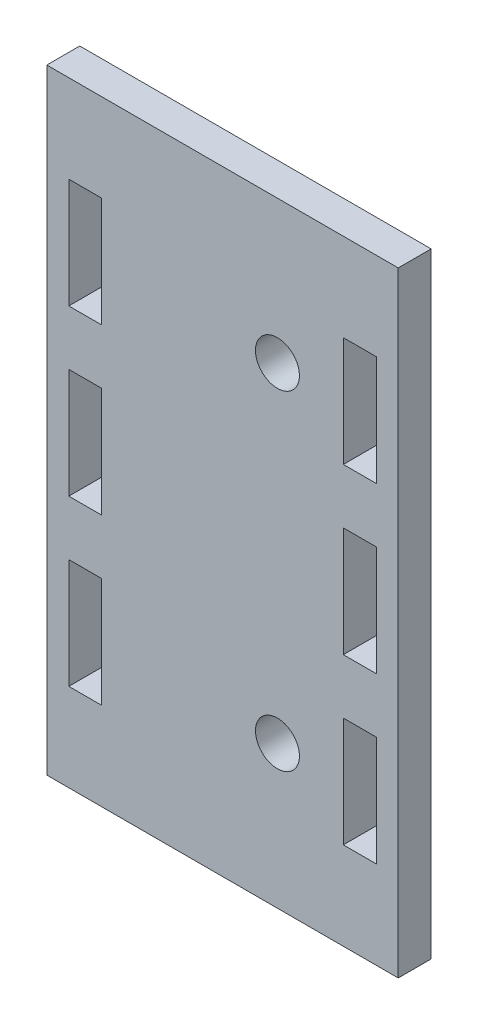
ISO-10303-21;
HEADER;
FILE_DESCRIPTION(('STEP AP214'),'2;1');
FILE_NAME('part.step','',(''),(''),'','','');
FILE_SCHEMA(('AUTOMOTIVE_DESIGN { 1 0 10303 214 1 1 1 1 }'));
ENDSEC;
DATA;
#1=APPLICATION_CONTEXT('core data for automotive mechanical design processes');
#2=APPLICATION_PROTOCOL_DEFINITION('international standard','automotive_design',2000,#1);
#3=PRODUCT_CONTEXT('',#1,'mechanical');
#4=PRODUCT('Part','Part','',(#3));
#5=PRODUCT_RELATED_PRODUCT_CATEGORY('part','',(#4));
#6=PRODUCT_DEFINITION_FORMATION('','',#4);
#7=PRODUCT_DEFINITION_CONTEXT('part definition',#1,'design');
#8=PRODUCT_DEFINITION('design','',#6,#7);
#9=PRODUCT_DEFINITION_SHAPE('','',#8);
#10=(LENGTH_UNIT() NAMED_UNIT(*) SI_UNIT(.MILLI.,.METRE.));
#11=(NAMED_UNIT(*) PLANE_ANGLE_UNIT() SI_UNIT($,.RADIAN.));
#12=(NAMED_UNIT(*) SI_UNIT($,.STERADIAN.) SOLID_ANGLE_UNIT());
#13=UNCERTAINTY_MEASURE_WITH_UNIT(LENGTH_MEASURE(1.E-05),#10,'distance_accuracy_value','');
#14=(GEOMETRIC_REPRESENTATION_CONTEXT(3) GLOBAL_UNCERTAINTY_ASSIGNED_CONTEXT((#13)) GLOBAL_UNIT_ASSIGNED_CONTEXT((#10,
#11,#12)) REPRESENTATION_CONTEXT('',''));
#15=CARTESIAN_POINT('',(0.,0.,0.));
#16=DIRECTION('',(0.,0.,1.));
#17=DIRECTION('',(1.,0.,0.));
#18=AXIS2_PLACEMENT_3D('',#15,#16,#17);
#19=CARTESIAN_POINT('',(0.,-20.,3.));
#20=DIRECTION('',(0.,-1.,0.));
#21=DIRECTION('',(0.,0.,-1.));
#22=AXIS2_PLACEMENT_3D('',#19,#20,#21);
#23=PLANE('',#22);
#24=DIRECTION('',(-1.,0.,0.));
#25=VECTOR('',#24,1.);
#26=CARTESIAN_POINT('',(0.,-20.,0.));
#27=LINE('',#26,#25);
#28=CARTESIAN_POINT('',(-1.99999999999999,-20.,0.));
#29=VERTEX_POINT('',#28);
#30=CARTESIAN_POINT('',(-4.99999999999999,-20.,0.));
#31=VERTEX_POINT('',#30);
#32=EDGE_CURVE('E331',#29,#31,#27,.T.);
#33=ORIENTED_EDGE('',*,*,#32,.T.);
#34=DIRECTION('',(0.,0.,-1.));
#35=VECTOR('',#34,1.);
#36=CARTESIAN_POINT('',(-4.99999999999999,-20.,3.));
#37=LINE('',#36,#35);
#38=CARTESIAN_POINT('',(-4.99999999999999,-20.,3.));
#39=VERTEX_POINT('',#38);
#40=EDGE_CURVE('E11',#39,#31,#37,.T.);
#41=ORIENTED_EDGE('',*,*,#40,.F.);
#42=DIRECTION('',(-1.,0.,0.));
#43=VECTOR('',#42,1.);
#44=CARTESIAN_POINT('',(0.,-20.,3.));
#45=LINE('',#44,#43);
#46=CARTESIAN_POINT('',(-1.99999999999999,-20.,3.));
#47=VERTEX_POINT('',#46);
#48=EDGE_CURVE('E239',#47,#39,#45,.T.);
#49=ORIENTED_EDGE('',*,*,#48,.F.);
#50=DIRECTION('',(0.,0.,-1.));
#51=VECTOR('',#50,1.);
#52=CARTESIAN_POINT('',(-1.99999999999999,-20.,3.));
#53=LINE('',#52,#51);
#54=EDGE_CURVE('E57',#47,#29,#53,.T.);
#55=ORIENTED_EDGE('',*,*,#54,.T.);
#56=EDGE_LOOP('',(#33,#41,#49,#55));
#57=FACE_BOUND('',#56,.T.);
#58=ADVANCED_FACE('F38',(#57),#23,.F.);
#59=CARTESIAN_POINT('',(-4.99999999999999,0.,3.));
#60=DIRECTION('',(-1.,0.,0.));
#61=DIRECTION('',(0.,0.,1.));
#62=AXIS2_PLACEMENT_3D('',#59,#60,#61);
#63=PLANE('',#62);
#64=DIRECTION('',(0.,1.,0.));
#65=VECTOR('',#64,1.);
#66=CARTESIAN_POINT('',(-4.99999999999999,0.,0.));
#67=LINE('',#66,#65);
#68=CARTESIAN_POINT('',(-4.99999999999999,-10.,0.));
#69=VERTEX_POINT('',#68);
#70=EDGE_CURVE('E245',#31,#69,#67,.T.);
#71=ORIENTED_EDGE('',*,*,#70,.T.);
#72=DIRECTION('',(0.,0.,-1.));
#73=VECTOR('',#72,1.);
#74=CARTESIAN_POINT('',(-4.99999999999999,-10.,3.));
#75=LINE('',#74,#73);
#76=CARTESIAN_POINT('',(-4.99999999999999,-10.,3.));
#77=VERTEX_POINT('',#76);
#78=EDGE_CURVE('E48',#77,#69,#75,.T.);
#79=ORIENTED_EDGE('',*,*,#78,.F.);
#80=DIRECTION('',(0.,1.,0.));
#81=VECTOR('',#80,1.);
#82=CARTESIAN_POINT('',(-4.99999999999999,0.,3.));
#83=LINE('',#82,#81);
#84=EDGE_CURVE('E232',#39,#77,#83,.T.);
#85=ORIENTED_EDGE('',*,*,#84,.F.);
#86=ORIENTED_EDGE('',*,*,#40,.T.);
#87=EDGE_LOOP('',(#71,#79,#85,#86));
#88=FACE_BOUND('',#87,.T.);
#89=ADVANCED_FACE('F244',(#88),#63,.F.);
#90=CARTESIAN_POINT('',(0.,-10.,3.));
#91=DIRECTION('',(0.,-1.,0.));
#92=DIRECTION('',(1.,0.,0.));
#93=AXIS2_PLACEMENT_3D('',#90,#91,#92);
#94=PLANE('',#93);
#95=DIRECTION('',(-1.,0.,0.));
#96=VECTOR('',#95,1.);
#97=CARTESIAN_POINT('',(0.,-10.,0.));
#98=LINE('',#97,#96);
#99=CARTESIAN_POINT('',(-1.99999999999999,-10.,0.));
#100=VERTEX_POINT('',#99);
#101=EDGE_CURVE('E334',#100,#69,#98,.T.);
#102=ORIENTED_EDGE('',*,*,#101,.F.);
#103=DIRECTION('',(0.,0.,-1.));
#104=VECTOR('',#103,1.);
#105=CARTESIAN_POINT('',(-1.99999999999999,-10.,3.));
#106=LINE('',#105,#104);
#107=CARTESIAN_POINT('',(-1.99999999999999,-10.,3.));
#108=VERTEX_POINT('',#107);
#109=EDGE_CURVE('E143',#108,#100,#106,.T.);
#110=ORIENTED_EDGE('',*,*,#109,.F.);
#111=DIRECTION('',(-1.,0.,0.));
#112=VECTOR('',#111,1.);
#113=CARTESIAN_POINT('',(0.,-10.,3.));
#114=LINE('',#113,#112);
#115=EDGE_CURVE('E238',#108,#77,#114,.T.);
#116=ORIENTED_EDGE('',*,*,#115,.T.);
#117=ORIENTED_EDGE('',*,*,#78,.T.);
#118=EDGE_LOOP('',(#102,#110,#116,#117));
#119=FACE_BOUND('',#118,.T.);
#120=ADVANCED_FACE('F249',(#119),#94,.T.);
#121=CARTESIAN_POINT('',(0.,20.,3.));
#122=DIRECTION('',(0.,1.,0.));
#123=DIRECTION('',(0.,0.,1.));
#124=AXIS2_PLACEMENT_3D('',#121,#122,#123);
#125=PLANE('',#124);
#126=DIRECTION('',(1.,0.,0.));
#127=VECTOR('',#126,1.);
#128=CARTESIAN_POINT('',(0.,20.,0.));
#129=LINE('',#128,#127);
#130=CARTESIAN_POINT('',(20.,20.,0.));
#131=VERTEX_POINT('',#130);
#132=CARTESIAN_POINT('',(23.,20.,0.));
#133=VERTEX_POINT('',#132);
#134=EDGE_CURVE('E319',#131,#133,#129,.T.);
#135=ORIENTED_EDGE('',*,*,#134,.T.);
#136=DIRECTION('',(0.,0.,-1.));
#137=VECTOR('',#136,1.);
#138=CARTESIAN_POINT('',(23.,20.,3.));
#139=LINE('',#138,#137);
#140=CARTESIAN_POINT('',(23.,20.,3.));
#141=VERTEX_POINT('',#140);
#142=EDGE_CURVE('E347',#141,#133,#139,.T.);
#143=ORIENTED_EDGE('',*,*,#142,.F.);
#144=DIRECTION('',(1.,0.,0.));
#145=VECTOR('',#144,1.);
#146=CARTESIAN_POINT('',(0.,20.,3.));
#147=LINE('',#146,#145);
#148=CARTESIAN_POINT('',(20.,20.,3.));
#149=VERTEX_POINT('',#148);
#150=EDGE_CURVE('E468',#149,#141,#147,.T.);
#151=ORIENTED_EDGE('',*,*,#150,.F.);
#152=DIRECTION('',(0.,0.,-1.));
#153=VECTOR('',#152,1.);
#154=CARTESIAN_POINT('',(20.,20.,3.));
#155=LINE('',#154,#153);
#156=EDGE_CURVE('E349',#149,#131,#155,.T.);
#157=ORIENTED_EDGE('',*,*,#156,.T.);
#158=EDGE_LOOP('',(#135,#143,#151,#157));
#159=FACE_BOUND('',#158,.T.);
#160=ADVANCED_FACE('F494',(#159),#125,.F.);
#161=CARTESIAN_POINT('',(23.,0.,3.));
#162=DIRECTION('',(1.,0.,0.));
#163=DIRECTION('',(0.,1.,0.));
#164=AXIS2_PLACEMENT_3D('',#161,#162,#163);
#165=PLANE('',#164);
#166=DIRECTION('',(0.,-1.,0.));
#167=VECTOR('',#166,1.);
#168=CARTESIAN_POINT('',(23.,0.,0.));
#169=LINE('',#168,#167);
#170=CARTESIAN_POINT('',(23.,10.,0.));
#171=VERTEX_POINT('',#170);
#172=EDGE_CURVE('E322',#133,#171,#169,.T.);
#173=ORIENTED_EDGE('',*,*,#172,.T.);
#174=DIRECTION('',(0.,0.,-1.));
#175=VECTOR('',#174,1.);
#176=CARTESIAN_POINT('',(23.,10.,3.));
#177=LINE('',#176,#175);
#178=CARTESIAN_POINT('',(23.,10.,3.));
#179=VERTEX_POINT('',#178);
#180=EDGE_CURVE('E354',#179,#171,#177,.T.);
#181=ORIENTED_EDGE('',*,*,#180,.F.);
#182=DIRECTION('',(0.,-1.,0.));
#183=VECTOR('',#182,1.);
#184=CARTESIAN_POINT('',(23.,0.,3.));
#185=LINE('',#184,#183);
#186=EDGE_CURVE('E471',#141,#179,#185,.T.);
#187=ORIENTED_EDGE('',*,*,#186,.F.);
#188=ORIENTED_EDGE('',*,*,#142,.T.);
#189=EDGE_LOOP('',(#173,#181,#187,#188));
#190=FACE_BOUND('',#189,.T.);
#191=ADVANCED_FACE('F496',(#190),#165,.F.);
#192=CARTESIAN_POINT('',(0.,10.,3.));
#193=DIRECTION('',(0.,1.,0.));
#194=DIRECTION('',(0.,0.,1.));
#195=AXIS2_PLACEMENT_3D('',#192,#193,#194);
#196=PLANE('',#195);
#197=DIRECTION('',(1.,0.,0.));
#198=VECTOR('',#197,1.);
#199=CARTESIAN_POINT('',(0.,10.,0.));
#200=LINE('',#199,#198);
#201=CARTESIAN_POINT('',(20.,10.,0.));
#202=VERTEX_POINT('',#201);
#203=EDGE_CURVE('E325',#202,#171,#200,.T.);
#204=ORIENTED_EDGE('',*,*,#203,.F.);
#205=DIRECTION('',(0.,0.,-1.));
#206=VECTOR('',#205,1.);
#207=CARTESIAN_POINT('',(20.,10.,3.));
#208=LINE('',#207,#206);
#209=CARTESIAN_POINT('',(20.,10.,3.));
#210=VERTEX_POINT('',#209);
#211=EDGE_CURVE('E351',#210,#202,#208,.T.);
#212=ORIENTED_EDGE('',*,*,#211,.F.);
#213=DIRECTION('',(1.,0.,0.));
#214=VECTOR('',#213,1.);
#215=CARTESIAN_POINT('',(0.,10.,3.));
#216=LINE('',#215,#214);
#217=EDGE_CURVE('E473',#210,#179,#216,.T.);
#218=ORIENTED_EDGE('',*,*,#217,.T.);
#219=ORIENTED_EDGE('',*,*,#180,.T.);
#220=EDGE_LOOP('',(#204,#212,#218,#219));
#221=FACE_BOUND('',#220,.T.);
#222=ADVANCED_FACE('F489',(#221),#196,.T.);
#223=CARTESIAN_POINT('',(0.,-5.00000000000001,3.));
#224=DIRECTION('',(0.,1.,0.));
#225=DIRECTION('',(-1.,0.,0.));
#226=AXIS2_PLACEMENT_3D('',#223,#224,#225);
#227=PLANE('',#226);
#228=DIRECTION('',(1.,0.,0.));
#229=VECTOR('',#228,1.);
#230=CARTESIAN_POINT('',(0.,-5.00000000000001,0.));
#231=LINE('',#230,#229);
#232=CARTESIAN_POINT('',(20.0000000000002,-5.,0.));
#233=VERTEX_POINT('',#232);
#234=CARTESIAN_POINT('',(22.9999999999997,-5.,0.));
#235=VERTEX_POINT('',#234);
#236=EDGE_CURVE('E307',#233,#235,#231,.T.);
#237=ORIENTED_EDGE('',*,*,#236,.F.);
#238=DIRECTION('',(0.,0.,-1.));
#239=VECTOR('',#238,1.);
#240=CARTESIAN_POINT('',(20.0000000000002,-5.,3.));
#241=LINE('',#240,#239);
#242=CARTESIAN_POINT('',(20.0000000000002,-5.,3.));
#243=VERTEX_POINT('',#242);
#244=EDGE_CURVE('E352',#243,#233,#241,.T.);
#245=ORIENTED_EDGE('',*,*,#244,.F.);
#246=DIRECTION('',(1.,0.,0.));
#247=VECTOR('',#246,1.);
#248=CARTESIAN_POINT('',(0.,-5.00000000000001,3.));
#249=LINE('',#248,#247);
#250=CARTESIAN_POINT('',(22.9999999999997,-5.,3.));
#251=VERTEX_POINT('',#250);
#252=EDGE_CURVE('E457',#243,#251,#249,.T.);
#253=ORIENTED_EDGE('',*,*,#252,.T.);
#254=DIRECTION('',(0.,0.,-1.));
#255=VECTOR('',#254,1.);
#256=CARTESIAN_POINT('',(22.9999999999997,-5.,3.));
#257=LINE('',#256,#255);
#258=EDGE_CURVE('E358',#251,#235,#257,.T.);
#259=ORIENTED_EDGE('',*,*,#258,.T.);
#260=EDGE_LOOP('',(#237,#245,#253,#259));
#261=FACE_BOUND('',#260,.T.);
#262=ADVANCED_FACE('F503',(#261),#227,.T.);
#263=CARTESIAN_POINT('',(20.0000000000002,0.,3.));
#264=DIRECTION('',(1.,0.,0.));
#265=DIRECTION('',(0.,0.,-1.));
#266=AXIS2_PLACEMENT_3D('',#263,#264,#265);
#267=PLANE('',#266);
#268=DIRECTION('',(0.,-1.,0.));
#269=VECTOR('',#268,1.);
#270=CARTESIAN_POINT('',(20.0000000000002,0.,0.));
#271=LINE('',#270,#269);
#272=CARTESIAN_POINT('',(20.0000000000002,5.,0.));
#273=VERTEX_POINT('',#272);
#274=EDGE_CURVE('E310',#273,#233,#271,.T.);
#275=ORIENTED_EDGE('',*,*,#274,.F.);
#276=DIRECTION('',(0.,0.,-1.));
#277=VECTOR('',#276,1.);
#278=CARTESIAN_POINT('',(20.0000000000002,5.,3.));
#279=LINE('',#278,#277);
#280=CARTESIAN_POINT('',(20.0000000000002,5.,3.));
#281=VERTEX_POINT('',#280);
#282=EDGE_CURVE('E364',#281,#273,#279,.T.);
#283=ORIENTED_EDGE('',*,*,#282,.F.);
#284=DIRECTION('',(0.,-1.,0.));
#285=VECTOR('',#284,1.);
#286=CARTESIAN_POINT('',(20.0000000000002,0.,3.));
#287=LINE('',#286,#285);
#288=EDGE_CURVE('E460',#281,#243,#287,.T.);
#289=ORIENTED_EDGE('',*,*,#288,.T.);
#290=ORIENTED_EDGE('',*,*,#244,.T.);
#291=EDGE_LOOP('',(#275,#283,#289,#290));
#292=FACE_BOUND('',#291,.T.);
#293=ADVANCED_FACE('F560',(#292),#267,.T.);
#294=CARTESIAN_POINT('',(0.,4.99999999999999,3.));
#295=DIRECTION('',(0.,1.,0.));
#296=DIRECTION('',(-1.,0.,0.));
#297=AXIS2_PLACEMENT_3D('',#294,#295,#296);
#298=PLANE('',#297);
#299=DIRECTION('',(1.,0.,0.));
#300=VECTOR('',#299,1.);
#301=CARTESIAN_POINT('',(0.,4.99999999999999,0.));
#302=LINE('',#301,#300);
#303=CARTESIAN_POINT('',(22.9999999999997,5.,0.));
#304=VERTEX_POINT('',#303);
#305=EDGE_CURVE('E313',#273,#304,#302,.T.);
#306=ORIENTED_EDGE('',*,*,#305,.T.);
#307=DIRECTION('',(0.,0.,-1.));
#308=VECTOR('',#307,1.);
#309=CARTESIAN_POINT('',(22.9999999999997,5.,3.));
#310=LINE('',#309,#308);
#311=CARTESIAN_POINT('',(22.9999999999997,5.,3.));
#312=VERTEX_POINT('',#311);
#313=EDGE_CURVE('E360',#312,#304,#310,.T.);
#314=ORIENTED_EDGE('',*,*,#313,.F.);
#315=DIRECTION('',(1.,0.,0.));
#316=VECTOR('',#315,1.);
#317=CARTESIAN_POINT('',(0.,4.99999999999999,3.));
#318=LINE('',#317,#316);
#319=EDGE_CURVE('E463',#281,#312,#318,.T.);
#320=ORIENTED_EDGE('',*,*,#319,.F.);
#321=ORIENTED_EDGE('',*,*,#282,.T.);
#322=EDGE_LOOP('',(#306,#314,#320,#321));
#323=FACE_BOUND('',#322,.T.);
#324=ADVANCED_FACE('F571',(#323),#298,.F.);
#325=CARTESIAN_POINT('',(0.,-20.,3.));
#326=DIRECTION('',(0.,1.,0.));
#327=DIRECTION('',(0.,0.,1.));
#328=AXIS2_PLACEMENT_3D('',#325,#326,#327);
#329=PLANE('',#328);
#330=DIRECTION('',(1.,0.,0.));
#331=VECTOR('',#330,1.);
#332=CARTESIAN_POINT('',(0.,-20.,0.));
#333=LINE('',#332,#331);
#334=CARTESIAN_POINT('',(20.0000000000003,-20.,0.));
#335=VERTEX_POINT('',#334);
#336=CARTESIAN_POINT('',(22.9999999999978,-20.,0.));
#337=VERTEX_POINT('',#336);
#338=EDGE_CURVE('E295',#335,#337,#333,.T.);
#339=ORIENTED_EDGE('',*,*,#338,.F.);
#340=DIRECTION('',(0.,0.,-1.));
#341=VECTOR('',#340,1.);
#342=CARTESIAN_POINT('',(20.0000000000003,-20.,3.));
#343=LINE('',#342,#341);
#344=CARTESIAN_POINT('',(20.0000000000003,-20.,3.));
#345=VERTEX_POINT('',#344);
#346=EDGE_CURVE('E361',#345,#335,#343,.T.);
#347=ORIENTED_EDGE('',*,*,#346,.F.);
#348=DIRECTION('',(1.,0.,0.));
#349=VECTOR('',#348,1.);
#350=CARTESIAN_POINT('',(0.,-20.,3.));
#351=LINE('',#350,#349);
#352=CARTESIAN_POINT('',(22.9999999999978,-20.,3.));
#353=VERTEX_POINT('',#352);
#354=EDGE_CURVE('E446',#345,#353,#351,.T.);
#355=ORIENTED_EDGE('',*,*,#354,.T.);
#356=DIRECTION('',(0.,0.,-1.));
#357=VECTOR('',#356,1.);
#358=CARTESIAN_POINT('',(22.9999999999978,-20.,3.));
#359=LINE('',#358,#357);
#360=EDGE_CURVE('E367',#353,#337,#359,.T.);
#361=ORIENTED_EDGE('',*,*,#360,.T.);
#362=EDGE_LOOP('',(#339,#347,#355,#361));
#363=FACE_BOUND('',#362,.T.);
#364=ADVANCED_FACE('F581',(#363),#329,.T.);
#365=CARTESIAN_POINT('',(20.0000000000003,0.,3.));
#366=DIRECTION('',(1.,0.,0.));
#367=DIRECTION('',(0.,0.,-1.));
#368=AXIS2_PLACEMENT_3D('',#365,#366,#367);
#369=PLANE('',#368);
#370=DIRECTION('',(0.,-1.,0.));
#371=VECTOR('',#370,1.);
#372=CARTESIAN_POINT('',(20.0000000000003,0.,0.));
#373=LINE('',#372,#371);
#374=CARTESIAN_POINT('',(20.0000000000003,-10.,0.));
#375=VERTEX_POINT('',#374);
#376=EDGE_CURVE('E298',#375,#335,#373,.T.);
#377=ORIENTED_EDGE('',*,*,#376,.F.);
#378=DIRECTION('',(0.,0.,-1.));
#379=VECTOR('',#378,1.);
#380=CARTESIAN_POINT('',(20.0000000000003,-10.,3.));
#381=LINE('',#380,#379);
#382=CARTESIAN_POINT('',(20.0000000000003,-10.,3.));
#383=VERTEX_POINT('',#382);
#384=EDGE_CURVE('E373',#383,#375,#381,.T.);
#385=ORIENTED_EDGE('',*,*,#384,.F.);
#386=DIRECTION('',(0.,-1.,0.));
#387=VECTOR('',#386,1.);
#388=CARTESIAN_POINT('',(20.0000000000003,0.,3.));
#389=LINE('',#388,#387);
#390=EDGE_CURVE('E449',#383,#345,#389,.T.);
#391=ORIENTED_EDGE('',*,*,#390,.T.);
#392=ORIENTED_EDGE('',*,*,#346,.T.);
#393=EDGE_LOOP('',(#377,#385,#391,#392));
#394=FACE_BOUND('',#393,.T.);
#395=ADVANCED_FACE('F591',(#394),#369,.T.);
#396=CARTESIAN_POINT('',(0.,-10.,3.));
#397=DIRECTION('',(0.,1.,0.));
#398=DIRECTION('',(0.,0.,1.));
#399=AXIS2_PLACEMENT_3D('',#396,#397,#398);
#400=PLANE('',#399);
#401=DIRECTION('',(1.,0.,0.));
#402=VECTOR('',#401,1.);
#403=CARTESIAN_POINT('',(0.,-10.,0.));
#404=LINE('',#403,#402);
#405=CARTESIAN_POINT('',(22.9999999999978,-10.,0.));
#406=VERTEX_POINT('',#405);
#407=EDGE_CURVE('E301',#375,#406,#404,.T.);
#408=ORIENTED_EDGE('',*,*,#407,.T.);
#409=DIRECTION('',(0.,0.,-1.));
#410=VECTOR('',#409,1.);
#411=CARTESIAN_POINT('',(22.9999999999978,-10.,3.));
#412=LINE('',#411,#410);
#413=CARTESIAN_POINT('',(22.9999999999978,-10.,3.));
#414=VERTEX_POINT('',#413);
#415=EDGE_CURVE('E369',#414,#406,#412,.T.);
#416=ORIENTED_EDGE('',*,*,#415,.F.);
#417=DIRECTION('',(1.,0.,0.));
#418=VECTOR('',#417,1.);
#419=CARTESIAN_POINT('',(0.,-10.,3.));
#420=LINE('',#419,#418);
#421=EDGE_CURVE('E452',#383,#414,#420,.T.);
#422=ORIENTED_EDGE('',*,*,#421,.F.);
#423=ORIENTED_EDGE('',*,*,#384,.T.);
#424=EDGE_LOOP('',(#408,#416,#422,#423));
#425=FACE_BOUND('',#424,.T.);
#426=ADVANCED_FACE('F602',(#425),#400,.F.);
#427=CARTESIAN_POINT('',(0.,5.,3.));
#428=DIRECTION('',(0.,-1.,0.));
#429=DIRECTION('',(1.,0.,0.));
#430=AXIS2_PLACEMENT_3D('',#427,#428,#429);
#431=PLANE('',#430);
#432=DIRECTION('',(-1.,0.,0.));
#433=VECTOR('',#432,1.);
#434=CARTESIAN_POINT('',(0.,5.,0.));
#435=LINE('',#434,#433);
#436=CARTESIAN_POINT('',(-2.00000000000004,5.,0.));
#437=VERTEX_POINT('',#436);
#438=CARTESIAN_POINT('',(-5.00000000000004,5.,0.));
#439=VERTEX_POINT('',#438);
#440=EDGE_CURVE('E283',#437,#439,#435,.T.);
#441=ORIENTED_EDGE('',*,*,#440,.F.);
#442=DIRECTION('',(0.,0.,-1.));
#443=VECTOR('',#442,1.);
#444=CARTESIAN_POINT('',(-2.00000000000004,5.,3.));
#445=LINE('',#444,#443);
#446=CARTESIAN_POINT('',(-2.00000000000004,5.,3.));
#447=VERTEX_POINT('',#446);
#448=EDGE_CURVE('E370',#447,#437,#445,.T.);
#449=ORIENTED_EDGE('',*,*,#448,.F.);
#450=DIRECTION('',(-1.,0.,0.));
#451=VECTOR('',#450,1.);
#452=CARTESIAN_POINT('',(0.,5.,3.));
#453=LINE('',#452,#451);
#454=CARTESIAN_POINT('',(-5.00000000000004,5.,3.));
#455=VERTEX_POINT('',#454);
#456=EDGE_CURVE('E435',#447,#455,#453,.T.);
#457=ORIENTED_EDGE('',*,*,#456,.T.);
#458=DIRECTION('',(0.,0.,-1.));
#459=VECTOR('',#458,1.);
#460=CARTESIAN_POINT('',(-5.00000000000004,5.,3.));
#461=LINE('',#460,#459);
#462=EDGE_CURVE('E376',#455,#439,#461,.T.);
#463=ORIENTED_EDGE('',*,*,#462,.T.);
#464=EDGE_LOOP('',(#441,#449,#457,#463));
#465=FACE_BOUND('',#464,.T.);
#466=ADVANCED_FACE('F612',(#465),#431,.T.);
#467=CARTESIAN_POINT('',(-2.00000000000004,0.,3.));
#468=DIRECTION('',(-1.,0.,0.));
#469=DIRECTION('',(0.,-1.,0.));
#470=AXIS2_PLACEMENT_3D('',#467,#468,#469);
#471=PLANE('',#470);
#472=DIRECTION('',(0.,1.,0.));
#473=VECTOR('',#472,1.);
#474=CARTESIAN_POINT('',(-2.00000000000004,0.,0.));
#475=LINE('',#474,#473);
#476=CARTESIAN_POINT('',(-2.00000000000004,-5.,0.));
#477=VERTEX_POINT('',#476);
#478=EDGE_CURVE('E286',#477,#437,#475,.T.);
#479=ORIENTED_EDGE('',*,*,#478,.F.);
#480=DIRECTION('',(0.,0.,-1.));
#481=VECTOR('',#480,1.);
#482=CARTESIAN_POINT('',(-2.00000000000004,-5.,3.));
#483=LINE('',#482,#481);
#484=CARTESIAN_POINT('',(-2.00000000000004,-5.,3.));
#485=VERTEX_POINT('',#484);
#486=EDGE_CURVE('E382',#485,#477,#483,.T.);
#487=ORIENTED_EDGE('',*,*,#486,.F.);
#488=DIRECTION('',(0.,1.,0.));
#489=VECTOR('',#488,1.);
#490=CARTESIAN_POINT('',(-2.00000000000004,0.,3.));
#491=LINE('',#490,#489);
#492=EDGE_CURVE('E438',#485,#447,#491,.T.);
#493=ORIENTED_EDGE('',*,*,#492,.T.);
#494=ORIENTED_EDGE('',*,*,#448,.T.);
#495=EDGE_LOOP('',(#479,#487,#493,#494));
#496=FACE_BOUND('',#495,.T.);
#497=ADVANCED_FACE('F622',(#496),#471,.T.);
#498=CARTESIAN_POINT('',(0.,-5.,3.));
#499=DIRECTION('',(0.,-1.,0.));
#500=DIRECTION('',(0.,0.,-1.));
#501=AXIS2_PLACEMENT_3D('',#498,#499,#500);
#502=PLANE('',#501);
#503=DIRECTION('',(-1.,0.,0.));
#504=VECTOR('',#503,1.);
#505=CARTESIAN_POINT('',(0.,-5.,0.));
#506=LINE('',#505,#504);
#507=CARTESIAN_POINT('',(-5.00000000000004,-5.,0.));
#508=VERTEX_POINT('',#507);
#509=EDGE_CURVE('E289',#477,#508,#506,.T.);
#510=ORIENTED_EDGE('',*,*,#509,.T.);
#511=DIRECTION('',(0.,0.,-1.));
#512=VECTOR('',#511,1.);
#513=CARTESIAN_POINT('',(-5.00000000000004,-5.,3.));
#514=LINE('',#513,#512);
#515=CARTESIAN_POINT('',(-5.00000000000004,-5.,3.));
#516=VERTEX_POINT('',#515);
#517=EDGE_CURVE('E378',#516,#508,#514,.T.);
#518=ORIENTED_EDGE('',*,*,#517,.F.);
#519=DIRECTION('',(-1.,0.,0.));
#520=VECTOR('',#519,1.);
#521=CARTESIAN_POINT('',(0.,-5.,3.));
#522=LINE('',#521,#520);
#523=EDGE_CURVE('E441',#485,#516,#522,.T.);
#524=ORIENTED_EDGE('',*,*,#523,.F.);
#525=ORIENTED_EDGE('',*,*,#486,.T.);
#526=EDGE_LOOP('',(#510,#518,#524,#525));
#527=FACE_BOUND('',#526,.T.);
#528=ADVANCED_FACE('F632',(#527),#502,.F.);
#529=CARTESIAN_POINT('',(0.,20.,3.));
#530=DIRECTION('',(0.,-1.,0.));
#531=DIRECTION('',(0.,0.,-1.));
#532=AXIS2_PLACEMENT_3D('',#529,#530,#531);
#533=PLANE('',#532);
#534=DIRECTION('',(-1.,0.,0.));
#535=VECTOR('',#534,1.);
#536=CARTESIAN_POINT('',(0.,20.,0.));
#537=LINE('',#536,#535);
#538=CARTESIAN_POINT('',(-2.0000000000001,20.,0.));
#539=VERTEX_POINT('',#538);
#540=CARTESIAN_POINT('',(-5.0000000000001,20.,0.));
#541=VERTEX_POINT('',#540);
#542=EDGE_CURVE('E271',#539,#541,#537,.T.);
#543=ORIENTED_EDGE('',*,*,#542,.F.);
#544=DIRECTION('',(0.,0.,-1.));
#545=VECTOR('',#544,1.);
#546=CARTESIAN_POINT('',(-2.0000000000001,20.,3.));
#547=LINE('',#546,#545);
#548=CARTESIAN_POINT('',(-2.0000000000001,20.,3.));
#549=VERTEX_POINT('',#548);
#550=EDGE_CURVE('E379',#549,#539,#547,.T.);
#551=ORIENTED_EDGE('',*,*,#550,.F.);
#552=DIRECTION('',(-1.,0.,0.));
#553=VECTOR('',#552,1.);
#554=CARTESIAN_POINT('',(0.,20.,3.));
#555=LINE('',#554,#553);
#556=CARTESIAN_POINT('',(-5.0000000000001,20.,3.));
#557=VERTEX_POINT('',#556);
#558=EDGE_CURVE('E419',#549,#557,#555,.T.);
#559=ORIENTED_EDGE('',*,*,#558,.T.);
#560=DIRECTION('',(0.,0.,-1.));
#561=VECTOR('',#560,1.);
#562=CARTESIAN_POINT('',(-5.0000000000001,20.,3.));
#563=LINE('',#562,#561);
#564=EDGE_CURVE('E385',#557,#541,#563,.T.);
#565=ORIENTED_EDGE('',*,*,#564,.T.);
#566=EDGE_LOOP('',(#543,#551,#559,#565));
#567=FACE_BOUND('',#566,.T.);
#568=ADVANCED_FACE('F642',(#567),#533,.T.);
#569=CARTESIAN_POINT('',(-2.00000000000009,0.,3.));
#570=DIRECTION('',(-1.,0.,0.));
#571=DIRECTION('',(0.,-1.,0.));
#572=AXIS2_PLACEMENT_3D('',#569,#570,#571);
#573=PLANE('',#572);
#574=DIRECTION('',(0.,1.,0.));
#575=VECTOR('',#574,1.);
#576=CARTESIAN_POINT('',(-2.00000000000009,0.,0.));
#577=LINE('',#576,#575);
#578=CARTESIAN_POINT('',(-2.00000000000009,9.99999999999999,0.));
#579=VERTEX_POINT('',#578);
#580=EDGE_CURVE('E274',#579,#539,#577,.T.);
#581=ORIENTED_EDGE('',*,*,#580,.F.);
#582=DIRECTION('',(0.,0.,-1.));
#583=VECTOR('',#582,1.);
#584=CARTESIAN_POINT('',(-2.00000000000009,9.99999999999999,3.));
#585=LINE('',#584,#583);
#586=CARTESIAN_POINT('',(-2.00000000000009,9.99999999999999,3.));
#587=VERTEX_POINT('',#586);
#588=EDGE_CURVE('E390',#587,#579,#585,.T.);
#589=ORIENTED_EDGE('',*,*,#588,.F.);
#590=DIRECTION('',(0.,1.,0.));
#591=VECTOR('',#590,1.);
#592=CARTESIAN_POINT('',(-2.00000000000009,0.,3.));
#593=LINE('',#592,#591);
#594=EDGE_CURVE('E423',#587,#549,#593,.T.);
#595=ORIENTED_EDGE('',*,*,#594,.T.);
#596=ORIENTED_EDGE('',*,*,#550,.T.);
#597=EDGE_LOOP('',(#581,#589,#595,#596));
#598=FACE_BOUND('',#597,.T.);
#599=ADVANCED_FACE('F652',(#598),#573,.T.);
#600=CARTESIAN_POINT('',(0.,9.99999999999999,3.));
#601=DIRECTION('',(0.,-1.,0.));
#602=DIRECTION('',(0.,0.,-1.));
#603=AXIS2_PLACEMENT_3D('',#600,#601,#602);
#604=PLANE('',#603);
#605=DIRECTION('',(-1.,0.,0.));
#606=VECTOR('',#605,1.);
#607=CARTESIAN_POINT('',(0.,9.99999999999999,0.));
#608=LINE('',#607,#606);
#609=CARTESIAN_POINT('',(-5.0000000000001,9.99999999999999,0.));
#610=VERTEX_POINT('',#609);
#611=EDGE_CURVE('E277',#579,#610,#608,.T.);
#612=ORIENTED_EDGE('',*,*,#611,.T.);
#613=DIRECTION('',(0.,0.,-1.));
#614=VECTOR('',#613,1.);
#615=CARTESIAN_POINT('',(-5.0000000000001,9.99999999999999,3.));
#616=LINE('',#615,#614);
#617=CARTESIAN_POINT('',(-5.0000000000001,9.99999999999999,3.));
#618=VERTEX_POINT('',#617);
#619=EDGE_CURVE('E387',#618,#610,#616,.T.);
#620=ORIENTED_EDGE('',*,*,#619,.F.);
#621=DIRECTION('',(-1.,0.,0.));
#622=VECTOR('',#621,1.);
#623=CARTESIAN_POINT('',(0.,9.99999999999999,3.));
#624=LINE('',#623,#622);
#625=EDGE_CURVE('E430',#587,#618,#624,.T.);
#626=ORIENTED_EDGE('',*,*,#625,.F.);
#627=ORIENTED_EDGE('',*,*,#588,.T.);
#628=EDGE_LOOP('',(#612,#620,#626,#627));
#629=FACE_BOUND('',#628,.T.);
#630=ADVANCED_FACE('F662',(#629),#604,.F.);
#631=CARTESIAN_POINT('',(0.,-28.,3.));
#632=DIRECTION('',(0.,1.,0.));
#633=DIRECTION('',(0.,0.,1.));
#634=AXIS2_PLACEMENT_3D('',#631,#632,#633);
#635=PLANE('',#634);
#636=DIRECTION('',(1.,0.,0.));
#637=VECTOR('',#636,1.);
#638=CARTESIAN_POINT('',(0.,-28.,0.));
#639=LINE('',#638,#637);
#640=CARTESIAN_POINT('',(-7.,-28.,0.));
#641=VERTEX_POINT('',#640);
#642=CARTESIAN_POINT('',(25.,-28.,0.));
#643=VERTEX_POINT('',#642);
#644=EDGE_CURVE('E262',#641,#643,#639,.T.);
#645=ORIENTED_EDGE('',*,*,#644,.T.);
#646=DIRECTION('',(0.,0.,-1.));
#647=VECTOR('',#646,1.);
#648=CARTESIAN_POINT('',(25.,-28.,3.));
#649=LINE('',#648,#647);
#650=CARTESIAN_POINT('',(25.,-28.,3.));
#651=VERTEX_POINT('',#650);
#652=EDGE_CURVE('E42',#651,#643,#649,.T.);
#653=ORIENTED_EDGE('',*,*,#652,.F.);
#654=DIRECTION('',(1.,0.,0.));
#655=VECTOR('',#654,1.);
#656=CARTESIAN_POINT('',(0.,-28.,3.));
#657=LINE('',#656,#655);
#658=CARTESIAN_POINT('',(-7.,-28.,3.));
#659=VERTEX_POINT('',#658);
#660=EDGE_CURVE('E345',#659,#651,#657,.T.);
#661=ORIENTED_EDGE('',*,*,#660,.F.);
#662=DIRECTION('',(0.,0.,-1.));
#663=VECTOR('',#662,1.);
#664=CARTESIAN_POINT('',(-7.,-28.,3.));
#665=LINE('',#664,#663);
#666=EDGE_CURVE('E261',#659,#641,#665,.T.);
#667=ORIENTED_EDGE('',*,*,#666,.T.);
#668=EDGE_LOOP('',(#645,#653,#661,#667));
#669=FACE_BOUND('',#668,.T.);
#670=ADVANCED_FACE('F40',(#669),#635,.F.);
#671=CARTESIAN_POINT('',(25.,0.,3.));
#672=DIRECTION('',(-1.,0.,0.));
#673=DIRECTION('',(0.,0.,1.));
#674=AXIS2_PLACEMENT_3D('',#671,#672,#673);
#675=PLANE('',#674);
#676=DIRECTION('',(0.,1.,0.));
#677=VECTOR('',#676,1.);
#678=CARTESIAN_POINT('',(25.,0.,0.));
#679=LINE('',#678,#677);
#680=CARTESIAN_POINT('',(25.,28.,0.));
#681=VERTEX_POINT('',#680);
#682=EDGE_CURVE('E265',#643,#681,#679,.T.);
#683=ORIENTED_EDGE('',*,*,#682,.T.);
#684=DIRECTION('',(0.,0.,-1.));
#685=VECTOR('',#684,1.);
#686=CARTESIAN_POINT('',(25.,28.,3.));
#687=LINE('',#686,#685);
#688=CARTESIAN_POINT('',(25.,28.,3.));
#689=VERTEX_POINT('',#688);
#690=EDGE_CURVE('E397',#689,#681,#687,.T.);
#691=ORIENTED_EDGE('',*,*,#690,.F.);
#692=DIRECTION('',(0.,1.,0.));
#693=VECTOR('',#692,1.);
#694=CARTESIAN_POINT('',(25.,0.,3.));
#695=LINE('',#694,#693);
#696=EDGE_CURVE('E156',#651,#689,#695,.T.);
#697=ORIENTED_EDGE('',*,*,#696,.F.);
#698=ORIENTED_EDGE('',*,*,#652,.T.);
#699=EDGE_LOOP('',(#683,#691,#697,#698));
#700=FACE_BOUND('',#699,.T.);
#701=ADVANCED_FACE('F403',(#700),#675,.F.);
#702=CARTESIAN_POINT('',(0.,28.,3.));
#703=DIRECTION('',(0.,-1.,0.));
#704=DIRECTION('',(0.,0.,-1.));
#705=AXIS2_PLACEMENT_3D('',#702,#703,#704);
#706=PLANE('',#705);
#707=DIRECTION('',(-1.,0.,0.));
#708=VECTOR('',#707,1.);
#709=CARTESIAN_POINT('',(0.,28.,0.));
#710=LINE('',#709,#708);
#711=CARTESIAN_POINT('',(-7.,28.,0.));
#712=VERTEX_POINT('',#711);
#713=EDGE_CURVE('E267',#681,#712,#710,.T.);
#714=ORIENTED_EDGE('',*,*,#713,.T.);
#715=DIRECTION('',(0.,0.,-1.));
#716=VECTOR('',#715,1.);
#717=CARTESIAN_POINT('',(-7.,28.,3.));
#718=LINE('',#717,#716);
#719=CARTESIAN_POINT('',(-7.,28.,3.));
#720=VERTEX_POINT('',#719);
#721=EDGE_CURVE('E395',#720,#712,#718,.T.);
#722=ORIENTED_EDGE('',*,*,#721,.F.);
#723=DIRECTION('',(-1.,0.,0.));
#724=VECTOR('',#723,1.);
#725=CARTESIAN_POINT('',(0.,28.,3.));
#726=LINE('',#725,#724);
#727=EDGE_CURVE('E420',#689,#720,#726,.T.);
#728=ORIENTED_EDGE('',*,*,#727,.F.);
#729=ORIENTED_EDGE('',*,*,#690,.T.);
#730=EDGE_LOOP('',(#714,#722,#728,#729));
#731=FACE_BOUND('',#730,.T.);
#732=ADVANCED_FACE('F413',(#731),#706,.F.);
#733=CARTESIAN_POINT('',(14.,-15.,3.));
#734=DIRECTION('',(0.,0.,-1.));
#735=DIRECTION('',(-1.,0.,0.));
#736=AXIS2_PLACEMENT_3D('',#733,#734,#735);
#737=CYLINDRICAL_SURFACE('',#736,2.);
#738=CARTESIAN_POINT('',(14.,-15.,3.));
#739=DIRECTION('',(0.,0.,1.));
#740=DIRECTION('',(1.,0.,0.));
#741=AXIS2_PLACEMENT_3D('',#738,#739,#740);
#742=CIRCLE('',#741,2.);
#743=CARTESIAN_POINT('',(16.,-15.,3.));
#744=VERTEX_POINT('',#743);
#745=EDGE_CURVE('E252',#744,#744,#742,.T.);
#746=ORIENTED_EDGE('',*,*,#745,.T.);
#747=EDGE_LOOP('',(#746));
#748=FACE_BOUND('',#747,.T.);
#749=CARTESIAN_POINT('',(14.,-15.,0.));
#750=DIRECTION('',(0.,0.,1.));
#751=DIRECTION('',(1.,0.,0.));
#752=AXIS2_PLACEMENT_3D('',#749,#750,#751);
#753=CIRCLE('',#752,2.);
#754=CARTESIAN_POINT('',(16.,-15.,0.));
#755=VERTEX_POINT('',#754);
#756=EDGE_CURVE('E339',#755,#755,#753,.T.);
#757=ORIENTED_EDGE('',*,*,#756,.F.);
#758=EDGE_LOOP('',(#757));
#759=FACE_BOUND('',#758,.T.);
#760=ADVANCED_FACE('F524',(#748,#759),#737,.F.);
#761=CARTESIAN_POINT('',(-1.99999999999999,0.,3.));
#762=DIRECTION('',(-1.,0.,0.));
#763=DIRECTION('',(0.,-1.,0.));
#764=AXIS2_PLACEMENT_3D('',#761,#762,#763);
#765=PLANE('',#764);
#766=DIRECTION('',(0.,1.,0.));
#767=VECTOR('',#766,1.);
#768=CARTESIAN_POINT('',(-1.99999999999999,0.,0.));
#769=LINE('',#768,#767);
#770=EDGE_CURVE('E336',#29,#100,#769,.T.);
#771=ORIENTED_EDGE('',*,*,#770,.F.);
#772=ORIENTED_EDGE('',*,*,#54,.F.);
#773=DIRECTION('',(0.,1.,0.));
#774=VECTOR('',#773,1.);
#775=CARTESIAN_POINT('',(-1.99999999999999,0.,3.));
#776=LINE('',#775,#774);
#777=EDGE_CURVE('E250',#47,#108,#776,.T.);
#778=ORIENTED_EDGE('',*,*,#777,.T.);
#779=ORIENTED_EDGE('',*,*,#109,.T.);
#780=EDGE_LOOP('',(#771,#772,#778,#779));
#781=FACE_BOUND('',#780,.T.);
#782=ADVANCED_FACE('F516',(#781),#765,.T.);
#783=CARTESIAN_POINT('',(20.,0.,3.));
#784=DIRECTION('',(1.,0.,0.));
#785=DIRECTION('',(0.,0.,-1.));
#786=AXIS2_PLACEMENT_3D('',#783,#784,#785);
#787=PLANE('',#786);
#788=DIRECTION('',(0.,-1.,0.));
#789=VECTOR('',#788,1.);
#790=CARTESIAN_POINT('',(20.,0.,0.));
#791=LINE('',#790,#789);
#792=EDGE_CURVE('E328',#131,#202,#791,.T.);
#793=ORIENTED_EDGE('',*,*,#792,.F.);
#794=ORIENTED_EDGE('',*,*,#156,.F.);
#795=DIRECTION('',(0.,-1.,0.));
#796=VECTOR('',#795,1.);
#797=CARTESIAN_POINT('',(20.,0.,3.));
#798=LINE('',#797,#796);
#799=EDGE_CURVE('E476',#149,#210,#798,.T.);
#800=ORIENTED_EDGE('',*,*,#799,.T.);
#801=ORIENTED_EDGE('',*,*,#211,.T.);
#802=EDGE_LOOP('',(#793,#794,#800,#801));
#803=FACE_BOUND('',#802,.T.);
#804=ADVANCED_FACE('F481',(#803),#787,.T.);
#805=CARTESIAN_POINT('',(22.9999999999997,0.,3.));
#806=DIRECTION('',(1.,0.,0.));
#807=DIRECTION('',(0.,1.,0.));
#808=AXIS2_PLACEMENT_3D('',#805,#806,#807);
#809=PLANE('',#808);
#810=DIRECTION('',(0.,-1.,0.));
#811=VECTOR('',#810,1.);
#812=CARTESIAN_POINT('',(22.9999999999997,0.,0.));
#813=LINE('',#812,#811);
#814=EDGE_CURVE('E316',#304,#235,#813,.T.);
#815=ORIENTED_EDGE('',*,*,#814,.T.);
#816=ORIENTED_EDGE('',*,*,#258,.F.);
#817=DIRECTION('',(0.,-1.,0.));
#818=VECTOR('',#817,1.);
#819=CARTESIAN_POINT('',(22.9999999999997,0.,3.));
#820=LINE('',#819,#818);
#821=EDGE_CURVE('E466',#312,#251,#820,.T.);
#822=ORIENTED_EDGE('',*,*,#821,.F.);
#823=ORIENTED_EDGE('',*,*,#313,.T.);
#824=EDGE_LOOP('',(#815,#816,#822,#823));
#825=FACE_BOUND('',#824,.T.);
#826=ADVANCED_FACE('F515',(#825),#809,.F.);
#827=CARTESIAN_POINT('',(22.9999999999978,0.,3.));
#828=DIRECTION('',(1.,0.,0.));
#829=DIRECTION('',(0.,1.,0.));
#830=AXIS2_PLACEMENT_3D('',#827,#828,#829);
#831=PLANE('',#830);
#832=DIRECTION('',(0.,-1.,0.));
#833=VECTOR('',#832,1.);
#834=CARTESIAN_POINT('',(22.9999999999978,0.,0.));
#835=LINE('',#834,#833);
#836=EDGE_CURVE('E304',#406,#337,#835,.T.);
#837=ORIENTED_EDGE('',*,*,#836,.T.);
#838=ORIENTED_EDGE('',*,*,#360,.F.);
#839=DIRECTION('',(0.,-1.,0.));
#840=VECTOR('',#839,1.);
#841=CARTESIAN_POINT('',(22.9999999999978,0.,3.));
#842=LINE('',#841,#840);
#843=EDGE_CURVE('E455',#414,#353,#842,.T.);
#844=ORIENTED_EDGE('',*,*,#843,.F.);
#845=ORIENTED_EDGE('',*,*,#415,.T.);
#846=EDGE_LOOP('',(#837,#838,#844,#845));
#847=FACE_BOUND('',#846,.T.);
#848=ADVANCED_FACE('F521',(#847),#831,.F.);
#849=CARTESIAN_POINT('',(-5.00000000000004,0.,3.));
#850=DIRECTION('',(-1.,0.,0.));
#851=DIRECTION('',(0.,0.,1.));
#852=AXIS2_PLACEMENT_3D('',#849,#850,#851);
#853=PLANE('',#852);
#854=DIRECTION('',(0.,1.,0.));
#855=VECTOR('',#854,1.);
#856=CARTESIAN_POINT('',(-5.00000000000004,0.,0.));
#857=LINE('',#856,#855);
#858=EDGE_CURVE('E292',#508,#439,#857,.T.);
#859=ORIENTED_EDGE('',*,*,#858,.T.);
#860=ORIENTED_EDGE('',*,*,#462,.F.);
#861=DIRECTION('',(0.,1.,0.));
#862=VECTOR('',#861,1.);
#863=CARTESIAN_POINT('',(-5.00000000000004,0.,3.));
#864=LINE('',#863,#862);
#865=EDGE_CURVE('E444',#516,#455,#864,.T.);
#866=ORIENTED_EDGE('',*,*,#865,.F.);
#867=ORIENTED_EDGE('',*,*,#517,.T.);
#868=EDGE_LOOP('',(#859,#860,#866,#867));
#869=FACE_BOUND('',#868,.T.);
#870=ADVANCED_FACE('F726',(#869),#853,.F.);
#871=CARTESIAN_POINT('',(-5.0000000000001,0.,3.));
#872=DIRECTION('',(-1.,0.,0.));
#873=DIRECTION('',(0.,0.,1.));
#874=AXIS2_PLACEMENT_3D('',#871,#872,#873);
#875=PLANE('',#874);
#876=DIRECTION('',(0.,1.,0.));
#877=VECTOR('',#876,1.);
#878=CARTESIAN_POINT('',(-5.0000000000001,0.,0.));
#879=LINE('',#878,#877);
#880=EDGE_CURVE('E280',#610,#541,#879,.T.);
#881=ORIENTED_EDGE('',*,*,#880,.T.);
#882=ORIENTED_EDGE('',*,*,#564,.F.);
#883=DIRECTION('',(0.,1.,0.));
#884=VECTOR('',#883,1.);
#885=CARTESIAN_POINT('',(-5.0000000000001,0.,3.));
#886=LINE('',#885,#884);
#887=EDGE_CURVE('E433',#618,#557,#886,.T.);
#888=ORIENTED_EDGE('',*,*,#887,.F.);
#889=ORIENTED_EDGE('',*,*,#619,.T.);
#890=EDGE_LOOP('',(#881,#882,#888,#889));
#891=FACE_BOUND('',#890,.T.);
#892=ADVANCED_FACE('F736',(#891),#875,.F.);
#893=CARTESIAN_POINT('',(-7.,0.,3.));
#894=DIRECTION('',(1.,0.,0.));
#895=DIRECTION('',(0.,0.,-1.));
#896=AXIS2_PLACEMENT_3D('',#893,#894,#895);
#897=PLANE('',#896);
#898=DIRECTION('',(0.,-1.,0.));
#899=VECTOR('',#898,1.);
#900=CARTESIAN_POINT('',(-7.,0.,0.));
#901=LINE('',#900,#899);
#902=EDGE_CURVE('E269',#712,#641,#901,.T.);
#903=ORIENTED_EDGE('',*,*,#902,.T.);
#904=ORIENTED_EDGE('',*,*,#666,.F.);
#905=DIRECTION('',(0.,-1.,0.));
#906=VECTOR('',#905,1.);
#907=CARTESIAN_POINT('',(-7.,0.,3.));
#908=LINE('',#907,#906);
#909=EDGE_CURVE('E417',#720,#659,#908,.T.);
#910=ORIENTED_EDGE('',*,*,#909,.F.);
#911=ORIENTED_EDGE('',*,*,#721,.T.);
#912=EDGE_LOOP('',(#903,#904,#910,#911));
#913=FACE_BOUND('',#912,.T.);
#914=ADVANCED_FACE('F416',(#913),#897,.F.);
#915=CARTESIAN_POINT('',(14.,15.,3.));
#916=DIRECTION('',(0.,0.,-1.));
#917=DIRECTION('',(-1.,0.,0.));
#918=AXIS2_PLACEMENT_3D('',#915,#916,#917);
#919=CYLINDRICAL_SURFACE('',#918,2.);
#920=CARTESIAN_POINT('',(14.,15.,3.));
#921=DIRECTION('',(0.,0.,1.));
#922=DIRECTION('',(1.,0.,0.));
#923=AXIS2_PLACEMENT_3D('',#920,#921,#922);
#924=CIRCLE('',#923,2.);
#925=CARTESIAN_POINT('',(16.,15.,3.));
#926=VERTEX_POINT('',#925);
#927=EDGE_CURVE('E258',#926,#926,#924,.F.);
#928=ORIENTED_EDGE('',*,*,#927,.F.);
#929=EDGE_LOOP('',(#928));
#930=FACE_BOUND('',#929,.T.);
#931=CARTESIAN_POINT('',(14.,15.,0.));
#932=DIRECTION('',(0.,0.,1.));
#933=DIRECTION('',(1.,0.,0.));
#934=AXIS2_PLACEMENT_3D('',#931,#932,#933);
#935=CIRCLE('',#934,2.);
#936=CARTESIAN_POINT('',(16.,15.,0.));
#937=VERTEX_POINT('',#936);
#938=EDGE_CURVE('E342',#937,#937,#935,.F.);
#939=ORIENTED_EDGE('',*,*,#938,.T.);
#940=EDGE_LOOP('',(#939));
#941=FACE_BOUND('',#940,.T.);
#942=ADVANCED_FACE('F756',(#930,#941),#919,.F.);
#943=CARTESIAN_POINT('',(0.,0.,3.));
#944=DIRECTION('',(0.,0.,1.));
#945=DIRECTION('',(1.,0.,0.));
#946=AXIS2_PLACEMENT_3D('',#943,#944,#945);
#947=PLANE('',#946);
#948=ORIENTED_EDGE('',*,*,#660,.T.);
#949=ORIENTED_EDGE('',*,*,#696,.T.);
#950=ORIENTED_EDGE('',*,*,#727,.T.);
#951=ORIENTED_EDGE('',*,*,#909,.T.);
#952=EDGE_LOOP('',(#948,#949,#950,#951));
#953=FACE_BOUND('',#952,.T.);
#954=ORIENTED_EDGE('',*,*,#558,.F.);
#955=ORIENTED_EDGE('',*,*,#594,.F.);
#956=ORIENTED_EDGE('',*,*,#625,.T.);
#957=ORIENTED_EDGE('',*,*,#887,.T.);
#958=EDGE_LOOP('',(#954,#955,#956,#957));
#959=FACE_BOUND('',#958,.T.);
#960=ORIENTED_EDGE('',*,*,#456,.F.);
#961=ORIENTED_EDGE('',*,*,#492,.F.);
#962=ORIENTED_EDGE('',*,*,#523,.T.);
#963=ORIENTED_EDGE('',*,*,#865,.T.);
#964=EDGE_LOOP('',(#960,#961,#962,#963));
#965=FACE_BOUND('',#964,.T.);
#966=ORIENTED_EDGE('',*,*,#354,.F.);
#967=ORIENTED_EDGE('',*,*,#390,.F.);
#968=ORIENTED_EDGE('',*,*,#421,.T.);
#969=ORIENTED_EDGE('',*,*,#843,.T.);
#970=EDGE_LOOP('',(#966,#967,#968,#969));
#971=FACE_BOUND('',#970,.T.);
#972=ORIENTED_EDGE('',*,*,#252,.F.);
#973=ORIENTED_EDGE('',*,*,#288,.F.);
#974=ORIENTED_EDGE('',*,*,#319,.T.);
#975=ORIENTED_EDGE('',*,*,#821,.T.);
#976=EDGE_LOOP('',(#972,#973,#974,#975));
#977=FACE_BOUND('',#976,.T.);
#978=ORIENTED_EDGE('',*,*,#150,.T.);
#979=ORIENTED_EDGE('',*,*,#186,.T.);
#980=ORIENTED_EDGE('',*,*,#217,.F.);
#981=ORIENTED_EDGE('',*,*,#799,.F.);
#982=EDGE_LOOP('',(#978,#979,#980,#981));
#983=FACE_BOUND('',#982,.T.);
#984=ORIENTED_EDGE('',*,*,#48,.T.);
#985=ORIENTED_EDGE('',*,*,#84,.T.);
#986=ORIENTED_EDGE('',*,*,#115,.F.);
#987=ORIENTED_EDGE('',*,*,#777,.F.);
#988=EDGE_LOOP('',(#984,#985,#986,#987));
#989=FACE_BOUND('',#988,.T.);
#990=ORIENTED_EDGE('',*,*,#745,.F.);
#991=EDGE_LOOP('',(#990));
#992=FACE_BOUND('',#991,.T.);
#993=ORIENTED_EDGE('',*,*,#927,.T.);
#994=EDGE_LOOP('',(#993));
#995=FACE_BOUND('',#994,.T.);
#996=ADVANCED_FACE('F234',(#953,#959,#965,#971,#977,#983,#989,#992,#995),#947,.T.);
#997=CARTESIAN_POINT('',(0.,0.,0.));
#998=DIRECTION('',(0.,0.,1.));
#999=DIRECTION('',(1.,0.,0.));
#1000=AXIS2_PLACEMENT_3D('',#997,#998,#999);
#1001=PLANE('',#1000);
#1002=ORIENTED_EDGE('',*,*,#644,.F.);
#1003=ORIENTED_EDGE('',*,*,#902,.F.);
#1004=ORIENTED_EDGE('',*,*,#713,.F.);
#1005=ORIENTED_EDGE('',*,*,#682,.F.);
#1006=EDGE_LOOP('',(#1002,#1003,#1004,#1005));
#1007=FACE_BOUND('',#1006,.T.);
#1008=ORIENTED_EDGE('',*,*,#542,.T.);
#1009=ORIENTED_EDGE('',*,*,#880,.F.);
#1010=ORIENTED_EDGE('',*,*,#611,.F.);
#1011=ORIENTED_EDGE('',*,*,#580,.T.);
#1012=EDGE_LOOP('',(#1008,#1009,#1010,#1011));
#1013=FACE_BOUND('',#1012,.T.);
#1014=ORIENTED_EDGE('',*,*,#440,.T.);
#1015=ORIENTED_EDGE('',*,*,#858,.F.);
#1016=ORIENTED_EDGE('',*,*,#509,.F.);
#1017=ORIENTED_EDGE('',*,*,#478,.T.);
#1018=EDGE_LOOP('',(#1014,#1015,#1016,#1017));
#1019=FACE_BOUND('',#1018,.T.);
#1020=ORIENTED_EDGE('',*,*,#338,.T.);
#1021=ORIENTED_EDGE('',*,*,#836,.F.);
#1022=ORIENTED_EDGE('',*,*,#407,.F.);
#1023=ORIENTED_EDGE('',*,*,#376,.T.);
#1024=EDGE_LOOP('',(#1020,#1021,#1022,#1023));
#1025=FACE_BOUND('',#1024,.T.);
#1026=ORIENTED_EDGE('',*,*,#236,.T.);
#1027=ORIENTED_EDGE('',*,*,#814,.F.);
#1028=ORIENTED_EDGE('',*,*,#305,.F.);
#1029=ORIENTED_EDGE('',*,*,#274,.T.);
#1030=EDGE_LOOP('',(#1026,#1027,#1028,#1029));
#1031=FACE_BOUND('',#1030,.T.);
#1032=ORIENTED_EDGE('',*,*,#134,.F.);
#1033=ORIENTED_EDGE('',*,*,#792,.T.);
#1034=ORIENTED_EDGE('',*,*,#203,.T.);
#1035=ORIENTED_EDGE('',*,*,#172,.F.);
#1036=EDGE_LOOP('',(#1032,#1033,#1034,#1035));
#1037=FACE_BOUND('',#1036,.T.);
#1038=ORIENTED_EDGE('',*,*,#32,.F.);
#1039=ORIENTED_EDGE('',*,*,#770,.T.);
#1040=ORIENTED_EDGE('',*,*,#101,.T.);
#1041=ORIENTED_EDGE('',*,*,#70,.F.);
#1042=EDGE_LOOP('',(#1038,#1039,#1040,#1041));
#1043=FACE_BOUND('',#1042,.T.);
#1044=ORIENTED_EDGE('',*,*,#756,.T.);
#1045=EDGE_LOOP('',(#1044));
#1046=FACE_BOUND('',#1045,.T.);
#1047=ORIENTED_EDGE('',*,*,#938,.F.);
#1048=EDGE_LOOP('',(#1047));
#1049=FACE_BOUND('',#1048,.T.);
#1050=ADVANCED_FACE('F410',(#1007,#1013,#1019,#1025,#1031,#1037,#1043,#1046,#1049),#1001,.F.);
#1051=CLOSED_SHELL('',(#58,#89,#120,#160,#191,#222,#262,#293,#324,#364,#395,#426,#466,#497,#528,
#568,#599,#630,#670,#701,#732,#760,#782,#804,#826,#848,#870,#892,#914,#942,#996,#1050));
#1052=MANIFOLD_SOLID_BREP('B2',#1051);
#1053=ADVANCED_BREP_SHAPE_REPRESENTATION('',(#18,#1052),#14);
#1054=SHAPE_DEFINITION_REPRESENTATION(#9,#1053);
ENDSEC;
END-ISO-10303-21;
